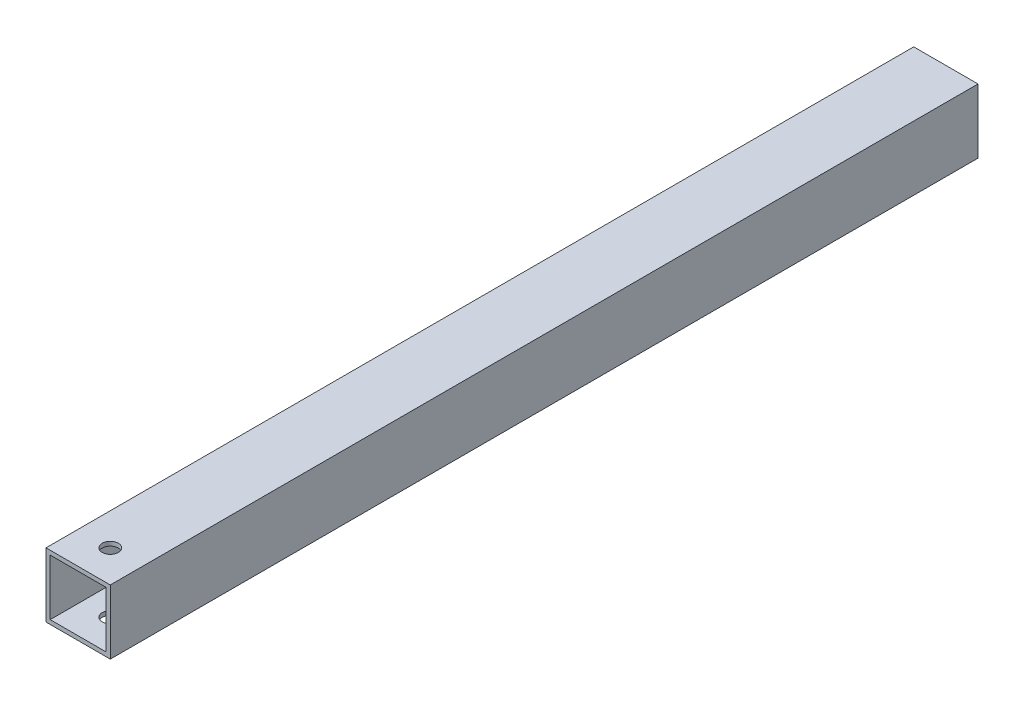
ISO-10303-21;
HEADER;
FILE_DESCRIPTION(('STEP AP214'),'2;1');
FILE_NAME('part.step','',(''),(''),'','','');
FILE_SCHEMA(('AUTOMOTIVE_DESIGN { 1 0 10303 214 1 1 1 1 }'));
ENDSEC;
DATA;
#1=APPLICATION_CONTEXT('core data for automotive mechanical design processes');
#2=APPLICATION_PROTOCOL_DEFINITION('international standard','automotive_design',2000,#1);
#3=PRODUCT_CONTEXT('',#1,'mechanical');
#4=PRODUCT('Part','Part','',(#3));
#5=PRODUCT_RELATED_PRODUCT_CATEGORY('part','',(#4));
#6=PRODUCT_DEFINITION_FORMATION('','',#4);
#7=PRODUCT_DEFINITION_CONTEXT('part definition',#1,'design');
#8=PRODUCT_DEFINITION('design','',#6,#7);
#9=PRODUCT_DEFINITION_SHAPE('','',#8);
#10=(LENGTH_UNIT() NAMED_UNIT(*) SI_UNIT(.MILLI.,.METRE.));
#11=(NAMED_UNIT(*) PLANE_ANGLE_UNIT() SI_UNIT($,.RADIAN.));
#12=(NAMED_UNIT(*) SI_UNIT($,.STERADIAN.) SOLID_ANGLE_UNIT());
#13=UNCERTAINTY_MEASURE_WITH_UNIT(LENGTH_MEASURE(1.E-05),#10,'distance_accuracy_value','');
#14=(GEOMETRIC_REPRESENTATION_CONTEXT(3) GLOBAL_UNCERTAINTY_ASSIGNED_CONTEXT((#13)) GLOBAL_UNIT_ASSIGNED_CONTEXT((#10,
#11,#12)) REPRESENTATION_CONTEXT('',''));
#15=CARTESIAN_POINT('',(0.,0.,0.));
#16=DIRECTION('',(0.,0.,1.));
#17=DIRECTION('',(1.,0.,0.));
#18=AXIS2_PLACEMENT_3D('',#15,#16,#17);
#19=CARTESIAN_POINT('',(-83.2355814775295,-51.039002092307,342.9));
#20=DIRECTION('',(1.,0.,0.));
#21=DIRECTION('',(0.,0.,-1.));
#22=AXIS2_PLACEMENT_3D('',#19,#20,#21);
#23=PLANE('',#22);
#24=DIRECTION('',(0.,-1.,0.));
#25=VECTOR('',#24,1.);
#26=CARTESIAN_POINT('',(-83.2355814775295,-51.039002092307,0.));
#27=LINE('',#26,#25);
#28=CARTESIAN_POINT('',(-83.2355814775295,-25.639002092307,0.));
#29=VERTEX_POINT('',#28);
#30=CARTESIAN_POINT('',(-83.2355814775295,-51.039002092307,0.));
#31=VERTEX_POINT('',#30);
#32=EDGE_CURVE('E134',#29,#31,#27,.T.);
#33=ORIENTED_EDGE('',*,*,#32,.T.);
#34=DIRECTION('',(0.,0.,-1.));
#35=VECTOR('',#34,1.);
#36=CARTESIAN_POINT('',(-83.2355814775295,-51.039002092307,342.9));
#37=LINE('',#36,#35);
#38=CARTESIAN_POINT('',(-83.2355814775295,-51.039002092307,342.9));
#39=VERTEX_POINT('',#38);
#40=EDGE_CURVE('E11',#39,#31,#37,.T.);
#41=ORIENTED_EDGE('',*,*,#40,.F.);
#42=DIRECTION('',(0.,-1.,0.));
#43=VECTOR('',#42,1.);
#44=CARTESIAN_POINT('',(-83.2355814775295,-51.039002092307,342.9));
#45=LINE('',#44,#43);
#46=CARTESIAN_POINT('',(-83.2355814775295,-25.639002092307,342.9));
#47=VERTEX_POINT('',#46);
#48=EDGE_CURVE('E138',#47,#39,#45,.T.);
#49=ORIENTED_EDGE('',*,*,#48,.F.);
#50=DIRECTION('',(0.,0.,-1.));
#51=VECTOR('',#50,1.);
#52=CARTESIAN_POINT('',(-83.2355814775295,-25.639002092307,342.9));
#53=LINE('',#52,#51);
#54=EDGE_CURVE('E148',#47,#29,#53,.T.);
#55=ORIENTED_EDGE('',*,*,#54,.T.);
#56=EDGE_LOOP('',(#33,#41,#49,#55));
#57=FACE_BOUND('',#56,.T.);
#58=ADVANCED_FACE('F33',(#57),#23,.F.);
#59=CARTESIAN_POINT('',(-83.2355814775295,-51.039002092307,342.9));
#60=DIRECTION('',(0.,1.,0.));
#61=DIRECTION('',(0.,0.,1.));
#62=AXIS2_PLACEMENT_3D('',#59,#60,#61);
#63=PLANE('',#62);
#64=CARTESIAN_POINT('',(-70.5355814775295,-51.039002092307,330.2));
#65=DIRECTION('',(0.,-1.,0.));
#66=DIRECTION('',(0.,0.,-1.));
#67=AXIS2_PLACEMENT_3D('',#64,#65,#66);
#68=CIRCLE('',#67,3.175);
#69=CARTESIAN_POINT('',(-70.5355814775295,-51.039002092307,327.025));
#70=VERTEX_POINT('',#69);
#71=EDGE_CURVE('E226',#70,#70,#68,.T.);
#72=ORIENTED_EDGE('',*,*,#71,.F.);
#73=EDGE_LOOP('',(#72));
#74=FACE_BOUND('',#73,.T.);
#75=DIRECTION('',(1.,0.,0.));
#76=VECTOR('',#75,1.);
#77=CARTESIAN_POINT('',(-83.2355814775295,-51.039002092307,0.));
#78=LINE('',#77,#76);
#79=CARTESIAN_POINT('',(-57.8355814775295,-51.039002092307,0.));
#80=VERTEX_POINT('',#79);
#81=EDGE_CURVE('E151',#31,#80,#78,.T.);
#82=ORIENTED_EDGE('',*,*,#81,.T.);
#83=DIRECTION('',(0.,0.,-1.));
#84=VECTOR('',#83,1.);
#85=CARTESIAN_POINT('',(-57.8355814775295,-51.039002092307,342.9));
#86=LINE('',#85,#84);
#87=CARTESIAN_POINT('',(-57.8355814775295,-51.039002092307,342.9));
#88=VERTEX_POINT('',#87);
#89=EDGE_CURVE('E41',#88,#80,#86,.T.);
#90=ORIENTED_EDGE('',*,*,#89,.F.);
#91=DIRECTION('',(1.,0.,0.));
#92=VECTOR('',#91,1.);
#93=CARTESIAN_POINT('',(-83.2355814775295,-51.039002092307,342.9));
#94=LINE('',#93,#92);
#95=EDGE_CURVE('E141',#39,#88,#94,.T.);
#96=ORIENTED_EDGE('',*,*,#95,.F.);
#97=ORIENTED_EDGE('',*,*,#40,.T.);
#98=EDGE_LOOP('',(#82,#90,#96,#97));
#99=FACE_BOUND('',#98,.T.);
#100=ADVANCED_FACE('F180',(#74,#99),#63,.F.);
#101=CARTESIAN_POINT('',(-57.8355814775295,-51.039002092307,342.9));
#102=DIRECTION('',(-1.,0.,0.));
#103=DIRECTION('',(0.,0.,1.));
#104=AXIS2_PLACEMENT_3D('',#101,#102,#103);
#105=PLANE('',#104);
#106=DIRECTION('',(0.,1.,0.));
#107=VECTOR('',#106,1.);
#108=CARTESIAN_POINT('',(-57.8355814775295,-51.039002092307,0.));
#109=LINE('',#108,#107);
#110=CARTESIAN_POINT('',(-57.8355814775295,-25.639002092307,0.));
#111=VERTEX_POINT('',#110);
#112=EDGE_CURVE('E153',#80,#111,#109,.T.);
#113=ORIENTED_EDGE('',*,*,#112,.T.);
#114=DIRECTION('',(0.,0.,-1.));
#115=VECTOR('',#114,1.);
#116=CARTESIAN_POINT('',(-57.8355814775295,-25.639002092307,342.9));
#117=LINE('',#116,#115);
#118=CARTESIAN_POINT('',(-57.8355814775295,-25.639002092307,342.9));
#119=VERTEX_POINT('',#118);
#120=EDGE_CURVE('E158',#119,#111,#117,.T.);
#121=ORIENTED_EDGE('',*,*,#120,.F.);
#122=DIRECTION('',(0.,1.,0.));
#123=VECTOR('',#122,1.);
#124=CARTESIAN_POINT('',(-57.8355814775295,-51.039002092307,342.9));
#125=LINE('',#124,#123);
#126=EDGE_CURVE('E144',#88,#119,#125,.T.);
#127=ORIENTED_EDGE('',*,*,#126,.F.);
#128=ORIENTED_EDGE('',*,*,#89,.T.);
#129=EDGE_LOOP('',(#113,#121,#127,#128));
#130=FACE_BOUND('',#129,.T.);
#131=ADVANCED_FACE('F166',(#130),#105,.F.);
#132=CARTESIAN_POINT('',(-83.2355814775295,-25.639002092307,342.9));
#133=DIRECTION('',(0.,-1.,0.));
#134=DIRECTION('',(1.,0.,0.));
#135=AXIS2_PLACEMENT_3D('',#132,#133,#134);
#136=PLANE('',#135);
#137=CARTESIAN_POINT('',(-70.5355814775295,-25.639002092307,330.2));
#138=DIRECTION('',(0.,-1.,0.));
#139=DIRECTION('',(0.,0.,-1.));
#140=AXIS2_PLACEMENT_3D('',#137,#138,#139);
#141=CIRCLE('',#140,3.175);
#142=CARTESIAN_POINT('',(-70.5355814775295,-25.639002092307,327.025));
#143=VERTEX_POINT('',#142);
#144=EDGE_CURVE('E221',#143,#143,#141,.T.);
#145=ORIENTED_EDGE('',*,*,#144,.T.);
#146=EDGE_LOOP('',(#145));
#147=FACE_BOUND('',#146,.T.);
#148=DIRECTION('',(-1.,0.,0.));
#149=VECTOR('',#148,1.);
#150=CARTESIAN_POINT('',(-83.2355814775295,-25.639002092307,0.));
#151=LINE('',#150,#149);
#152=EDGE_CURVE('E142',#111,#29,#151,.T.);
#153=ORIENTED_EDGE('',*,*,#152,.T.);
#154=ORIENTED_EDGE('',*,*,#54,.F.);
#155=DIRECTION('',(-1.,0.,0.));
#156=VECTOR('',#155,1.);
#157=CARTESIAN_POINT('',(-83.2355814775295,-25.639002092307,342.9));
#158=LINE('',#157,#156);
#159=EDGE_CURVE('E146',#119,#47,#158,.T.);
#160=ORIENTED_EDGE('',*,*,#159,.F.);
#161=ORIENTED_EDGE('',*,*,#120,.T.);
#162=EDGE_LOOP('',(#153,#154,#160,#161));
#163=FACE_BOUND('',#162,.T.);
#164=ADVANCED_FACE('F173',(#147,#163),#136,.F.);
#165=CARTESIAN_POINT('',(0.,0.,342.9));
#166=DIRECTION('',(0.,0.,-1.));
#167=DIRECTION('',(-1.,0.,0.));
#168=AXIS2_PLACEMENT_3D('',#165,#166,#167);
#169=PLANE('',#168);
#170=DIRECTION('',(1.,0.,0.));
#171=VECTOR('',#170,1.);
#172=CARTESIAN_POINT('',(-81.5845814775295,-49.388002092307,342.9));
#173=LINE('',#172,#171);
#174=CARTESIAN_POINT('',(-81.5845814775295,-49.388002092307,342.9));
#175=VERTEX_POINT('',#174);
#176=CARTESIAN_POINT('',(-59.4865814775295,-49.388002092307,342.9));
#177=VERTEX_POINT('',#176);
#178=EDGE_CURVE('E128',#175,#177,#173,.T.);
#179=ORIENTED_EDGE('',*,*,#178,.F.);
#180=DIRECTION('',(0.,-1.,0.));
#181=VECTOR('',#180,1.);
#182=CARTESIAN_POINT('',(-81.5845814775295,-27.290002092307,342.9));
#183=LINE('',#182,#181);
#184=CARTESIAN_POINT('',(-81.5845814775295,-27.290002092307,342.9));
#185=VERTEX_POINT('',#184);
#186=EDGE_CURVE('E48',#185,#175,#183,.T.);
#187=ORIENTED_EDGE('',*,*,#186,.F.);
#188=DIRECTION('',(-1.,0.,0.));
#189=VECTOR('',#188,1.);
#190=CARTESIAN_POINT('',(-81.5845814775295,-27.290002092307,342.9));
#191=LINE('',#190,#189);
#192=CARTESIAN_POINT('',(-59.4865814775295,-27.290002092307,342.9));
#193=VERTEX_POINT('',#192);
#194=EDGE_CURVE('E116',#193,#185,#191,.T.);
#195=ORIENTED_EDGE('',*,*,#194,.F.);
#196=DIRECTION('',(0.,1.,0.));
#197=VECTOR('',#196,1.);
#198=CARTESIAN_POINT('',(-59.4865814775295,-27.290002092307,342.9));
#199=LINE('',#198,#197);
#200=EDGE_CURVE('E119',#177,#193,#199,.T.);
#201=ORIENTED_EDGE('',*,*,#200,.F.);
#202=EDGE_LOOP('',(#179,#187,#195,#201));
#203=FACE_BOUND('',#202,.T.);
#204=ORIENTED_EDGE('',*,*,#48,.T.);
#205=ORIENTED_EDGE('',*,*,#95,.T.);
#206=ORIENTED_EDGE('',*,*,#126,.T.);
#207=ORIENTED_EDGE('',*,*,#159,.T.);
#208=EDGE_LOOP('',(#204,#205,#206,#207));
#209=FACE_BOUND('',#208,.T.);
#210=ADVANCED_FACE('F179',(#203,#209),#169,.F.);
#211=CARTESIAN_POINT('',(0.,0.,0.));
#212=DIRECTION('',(0.,0.,-1.));
#213=DIRECTION('',(-1.,0.,0.));
#214=AXIS2_PLACEMENT_3D('',#211,#212,#213);
#215=PLANE('',#214);
#216=DIRECTION('',(0.,-1.,0.));
#217=VECTOR('',#216,1.);
#218=CARTESIAN_POINT('',(-81.5845814775295,-27.290002092307,0.));
#219=LINE('',#218,#217);
#220=CARTESIAN_POINT('',(-81.5845814775295,-27.290002092307,0.));
#221=VERTEX_POINT('',#220);
#222=CARTESIAN_POINT('',(-81.5845814775295,-49.388002092307,0.));
#223=VERTEX_POINT('',#222);
#224=EDGE_CURVE('E100',#221,#223,#219,.T.);
#225=ORIENTED_EDGE('',*,*,#224,.T.);
#226=DIRECTION('',(1.,0.,0.));
#227=VECTOR('',#226,1.);
#228=CARTESIAN_POINT('',(-81.5845814775295,-49.388002092307,0.));
#229=LINE('',#228,#227);
#230=CARTESIAN_POINT('',(-59.4865814775295,-49.388002092307,0.));
#231=VERTEX_POINT('',#230);
#232=EDGE_CURVE('E109',#223,#231,#229,.T.);
#233=ORIENTED_EDGE('',*,*,#232,.T.);
#234=DIRECTION('',(0.,1.,0.));
#235=VECTOR('',#234,1.);
#236=CARTESIAN_POINT('',(-59.4865814775295,-27.290002092307,0.));
#237=LINE('',#236,#235);
#238=CARTESIAN_POINT('',(-59.4865814775295,-27.290002092307,0.));
#239=VERTEX_POINT('',#238);
#240=EDGE_CURVE('E56',#231,#239,#237,.T.);
#241=ORIENTED_EDGE('',*,*,#240,.T.);
#242=DIRECTION('',(-1.,0.,0.));
#243=VECTOR('',#242,1.);
#244=CARTESIAN_POINT('',(-81.5845814775295,-27.290002092307,0.));
#245=LINE('',#244,#243);
#246=EDGE_CURVE('E106',#239,#221,#245,.T.);
#247=ORIENTED_EDGE('',*,*,#246,.T.);
#248=EDGE_LOOP('',(#225,#233,#241,#247));
#249=FACE_BOUND('',#248,.T.);
#250=ORIENTED_EDGE('',*,*,#32,.F.);
#251=ORIENTED_EDGE('',*,*,#152,.F.);
#252=ORIENTED_EDGE('',*,*,#112,.F.);
#253=ORIENTED_EDGE('',*,*,#81,.F.);
#254=EDGE_LOOP('',(#250,#251,#252,#253));
#255=FACE_BOUND('',#254,.T.);
#256=ADVANCED_FACE('F113',(#249,#255),#215,.T.);
#257=CARTESIAN_POINT('',(-81.5845814775295,-27.290002092307,0.));
#258=DIRECTION('',(-1.,0.,0.));
#259=DIRECTION('',(0.,0.,1.));
#260=AXIS2_PLACEMENT_3D('',#257,#258,#259);
#261=PLANE('',#260);
#262=ORIENTED_EDGE('',*,*,#186,.T.);
#263=DIRECTION('',(0.,0.,1.));
#264=VECTOR('',#263,1.);
#265=CARTESIAN_POINT('',(-81.5845814775295,-49.388002092307,0.));
#266=LINE('',#265,#264);
#267=EDGE_CURVE('E96',#223,#175,#266,.T.);
#268=ORIENTED_EDGE('',*,*,#267,.F.);
#269=ORIENTED_EDGE('',*,*,#224,.F.);
#270=DIRECTION('',(0.,0.,1.));
#271=VECTOR('',#270,1.);
#272=CARTESIAN_POINT('',(-81.5845814775295,-27.290002092307,0.));
#273=LINE('',#272,#271);
#274=EDGE_CURVE('E132',#221,#185,#273,.T.);
#275=ORIENTED_EDGE('',*,*,#274,.T.);
#276=EDGE_LOOP('',(#262,#268,#269,#275));
#277=FACE_BOUND('',#276,.T.);
#278=ADVANCED_FACE('F98',(#277),#261,.F.);
#279=CARTESIAN_POINT('',(-81.5845814775295,-27.290002092307,0.));
#280=DIRECTION('',(0.,1.,0.));
#281=DIRECTION('',(0.,0.,1.));
#282=AXIS2_PLACEMENT_3D('',#279,#280,#281);
#283=PLANE('',#282);
#284=CARTESIAN_POINT('',(-70.5355814775295,-27.290002092307,330.2));
#285=DIRECTION('',(0.,1.,0.));
#286=DIRECTION('',(0.,0.,1.));
#287=AXIS2_PLACEMENT_3D('',#284,#285,#286);
#288=CIRCLE('',#287,3.175);
#289=CARTESIAN_POINT('',(-70.5355814775295,-27.290002092307,333.375));
#290=VERTEX_POINT('',#289);
#291=EDGE_CURVE('E122',#290,#290,#288,.T.);
#292=ORIENTED_EDGE('',*,*,#291,.T.);
#293=EDGE_LOOP('',(#292));
#294=FACE_BOUND('',#293,.T.);
#295=ORIENTED_EDGE('',*,*,#194,.T.);
#296=ORIENTED_EDGE('',*,*,#274,.F.);
#297=ORIENTED_EDGE('',*,*,#246,.F.);
#298=DIRECTION('',(0.,0.,1.));
#299=VECTOR('',#298,1.);
#300=CARTESIAN_POINT('',(-59.4865814775295,-27.290002092307,0.));
#301=LINE('',#300,#299);
#302=EDGE_CURVE('E135',#239,#193,#301,.T.);
#303=ORIENTED_EDGE('',*,*,#302,.T.);
#304=EDGE_LOOP('',(#295,#296,#297,#303));
#305=FACE_BOUND('',#304,.T.);
#306=ADVANCED_FACE('F200',(#294,#305),#283,.F.);
#307=CARTESIAN_POINT('',(-59.4865814775295,-27.290002092307,0.));
#308=DIRECTION('',(1.,0.,0.));
#309=DIRECTION('',(0.,1.,0.));
#310=AXIS2_PLACEMENT_3D('',#307,#308,#309);
#311=PLANE('',#310);
#312=ORIENTED_EDGE('',*,*,#200,.T.);
#313=ORIENTED_EDGE('',*,*,#302,.F.);
#314=ORIENTED_EDGE('',*,*,#240,.F.);
#315=DIRECTION('',(0.,0.,1.));
#316=VECTOR('',#315,1.);
#317=CARTESIAN_POINT('',(-59.4865814775295,-49.388002092307,0.));
#318=LINE('',#317,#316);
#319=EDGE_CURVE('E105',#231,#177,#318,.T.);
#320=ORIENTED_EDGE('',*,*,#319,.T.);
#321=EDGE_LOOP('',(#312,#313,#314,#320));
#322=FACE_BOUND('',#321,.T.);
#323=ADVANCED_FACE('F204',(#322),#311,.F.);
#324=CARTESIAN_POINT('',(-81.5845814775295,-49.388002092307,0.));
#325=DIRECTION('',(0.,-1.,0.));
#326=DIRECTION('',(0.,0.,-1.));
#327=AXIS2_PLACEMENT_3D('',#324,#325,#326);
#328=PLANE('',#327);
#329=CARTESIAN_POINT('',(-70.5355814775295,-49.388002092307,330.2));
#330=DIRECTION('',(0.,-1.,0.));
#331=DIRECTION('',(0.,0.,-1.));
#332=AXIS2_PLACEMENT_3D('',#329,#330,#331);
#333=CIRCLE('',#332,3.175);
#334=CARTESIAN_POINT('',(-70.5355814775295,-49.388002092307,327.025));
#335=VERTEX_POINT('',#334);
#336=EDGE_CURVE('E36',#335,#335,#333,.T.);
#337=ORIENTED_EDGE('',*,*,#336,.T.);
#338=EDGE_LOOP('',(#337));
#339=FACE_BOUND('',#338,.T.);
#340=ORIENTED_EDGE('',*,*,#178,.T.);
#341=ORIENTED_EDGE('',*,*,#319,.F.);
#342=ORIENTED_EDGE('',*,*,#232,.F.);
#343=ORIENTED_EDGE('',*,*,#267,.T.);
#344=EDGE_LOOP('',(#340,#341,#342,#343));
#345=FACE_BOUND('',#344,.T.);
#346=ADVANCED_FACE('F110',(#339,#345),#328,.F.);
#347=CARTESIAN_POINT('',(-70.5355814775295,-25.639002092307,330.2));
#348=DIRECTION('',(0.,-1.,0.));
#349=DIRECTION('',(0.,0.,-1.));
#350=AXIS2_PLACEMENT_3D('',#347,#348,#349);
#351=CYLINDRICAL_SURFACE('',#350,3.175);
#352=ORIENTED_EDGE('',*,*,#71,.T.);
#353=EDGE_LOOP('',(#352));
#354=FACE_BOUND('',#353,.T.);
#355=ORIENTED_EDGE('',*,*,#336,.F.);
#356=EDGE_LOOP('',(#355));
#357=FACE_BOUND('',#356,.T.);
#358=ADVANCED_FACE('F203',(#354,#357),#351,.F.);
#359=ORIENTED_EDGE('',*,*,#144,.F.);
#360=EDGE_LOOP('',(#359));
#361=FACE_BOUND('',#360,.T.);
#362=ORIENTED_EDGE('',*,*,#291,.F.);
#363=EDGE_LOOP('',(#362));
#364=FACE_BOUND('',#363,.T.);
#365=ADVANCED_FACE('F211',(#361,#364),#351,.F.);
#366=CLOSED_SHELL('',(#58,#100,#131,#164,#210,#256,#278,#306,#323,#346,#358,#365));
#367=MANIFOLD_SOLID_BREP('B2',#366);
#368=ADVANCED_BREP_SHAPE_REPRESENTATION('',(#18,#367),#14);
#369=SHAPE_DEFINITION_REPRESENTATION(#9,#368);
ENDSEC;
END-ISO-10303-21;
